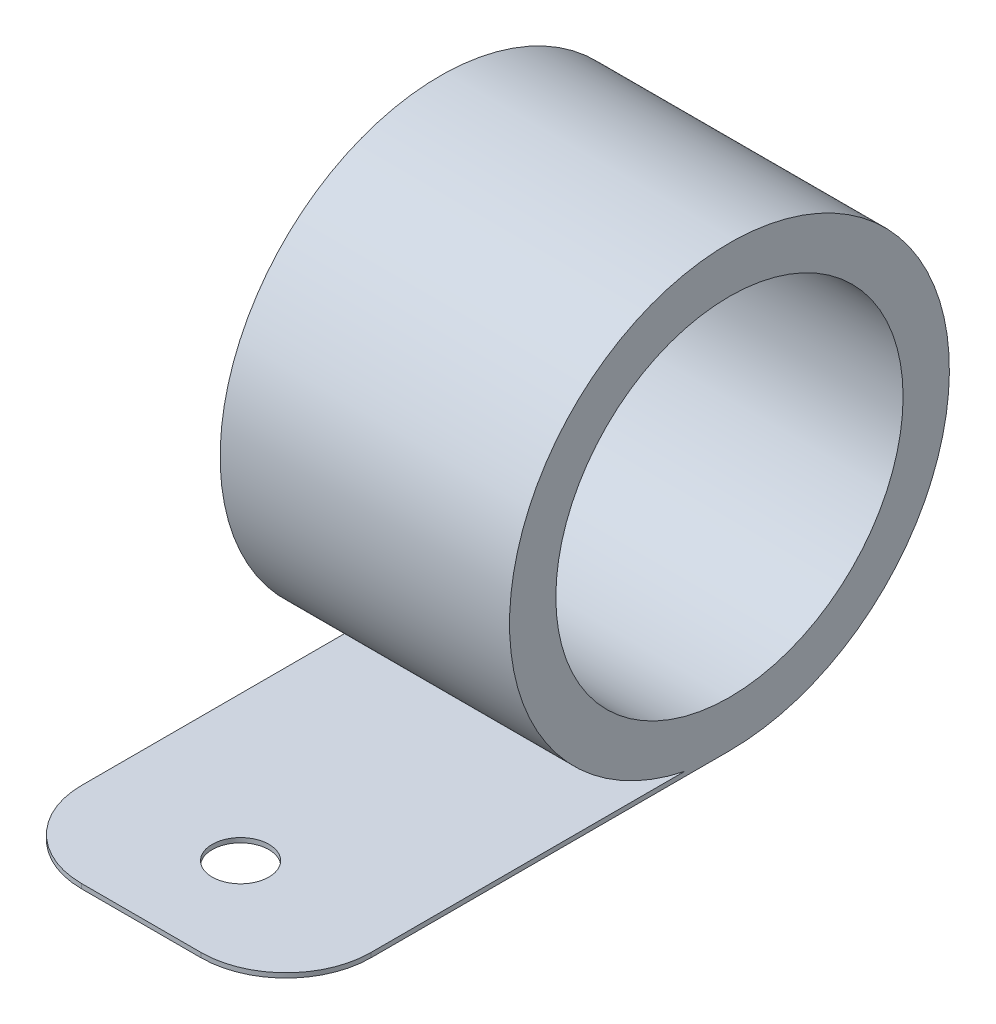
ISO-10303-21;
HEADER;
FILE_DESCRIPTION(('STEP AP214'),'2;1');
FILE_NAME('part.step','',(''),(''),'','','');
FILE_SCHEMA(('AUTOMOTIVE_DESIGN { 1 0 10303 214 1 1 1 1 }'));
ENDSEC;
DATA;
#1=APPLICATION_CONTEXT('core data for automotive mechanical design processes');
#2=APPLICATION_PROTOCOL_DEFINITION('international standard','automotive_design',2000,#1);
#3=PRODUCT_CONTEXT('',#1,'mechanical');
#4=PRODUCT('Part','Part','',(#3));
#5=PRODUCT_RELATED_PRODUCT_CATEGORY('part','',(#4));
#6=PRODUCT_DEFINITION_FORMATION('','',#4);
#7=PRODUCT_DEFINITION_CONTEXT('part definition',#1,'design');
#8=PRODUCT_DEFINITION('design','',#6,#7);
#9=PRODUCT_DEFINITION_SHAPE('','',#8);
#10=(LENGTH_UNIT() NAMED_UNIT(*) SI_UNIT(.MILLI.,.METRE.));
#11=(NAMED_UNIT(*) PLANE_ANGLE_UNIT() SI_UNIT($,.RADIAN.));
#12=(NAMED_UNIT(*) SI_UNIT($,.STERADIAN.) SOLID_ANGLE_UNIT());
#13=UNCERTAINTY_MEASURE_WITH_UNIT(LENGTH_MEASURE(1.E-05),#10,'distance_accuracy_value','');
#14=(GEOMETRIC_REPRESENTATION_CONTEXT(3) GLOBAL_UNCERTAINTY_ASSIGNED_CONTEXT((#13)) GLOBAL_UNIT_ASSIGNED_CONTEXT((#10,
#11,#12)) REPRESENTATION_CONTEXT('',''));
#15=CARTESIAN_POINT('',(0.,0.,0.));
#16=DIRECTION('',(0.,0.,1.));
#17=DIRECTION('',(1.,0.,0.));
#18=AXIS2_PLACEMENT_3D('',#15,#16,#17);
#19=CARTESIAN_POINT('',(12.7,0.,0.));
#20=DIRECTION('',(-1.,0.,0.));
#21=DIRECTION('',(0.,0.,1.));
#22=AXIS2_PLACEMENT_3D('',#19,#20,#21);
#23=CYLINDRICAL_SURFACE('',#22,19.304);
#24=DIRECTION('',(-1.,0.,0.));
#25=VECTOR('',#24,1.);
#26=CARTESIAN_POINT('',(12.7,-18.8976,3.940194188108));
#27=LINE('',#26,#25);
#28=CARTESIAN_POINT('',(12.7,-18.8976,3.940194188108));
#29=VERTEX_POINT('',#28);
#30=CARTESIAN_POINT('',(-12.7,-18.8976,3.940194188108));
#31=VERTEX_POINT('',#30);
#32=EDGE_CURVE('E118',#29,#31,#27,.T.);
#33=ORIENTED_EDGE('',*,*,#32,.F.);
#34=CARTESIAN_POINT('',(12.7,0.,0.));
#35=DIRECTION('',(1.,0.,0.));
#36=DIRECTION('',(0.,0.,-1.));
#37=AXIS2_PLACEMENT_3D('',#34,#35,#36);
#38=CIRCLE('',#37,19.304);
#39=CARTESIAN_POINT('',(12.7,-19.304,0.));
#40=VERTEX_POINT('',#39);
#41=EDGE_CURVE('E101',#40,#29,#38,.T.);
#42=ORIENTED_EDGE('',*,*,#41,.F.);
#43=DIRECTION('',(-1.,0.,0.));
#44=VECTOR('',#43,1.);
#45=CARTESIAN_POINT('',(12.7,-19.304,0.));
#46=LINE('',#45,#44);
#47=CARTESIAN_POINT('',(-12.7,-19.304,0.));
#48=VERTEX_POINT('',#47);
#49=EDGE_CURVE('E105',#40,#48,#46,.T.);
#50=ORIENTED_EDGE('',*,*,#49,.T.);
#51=CARTESIAN_POINT('',(-12.7,0.,0.));
#52=DIRECTION('',(1.,0.,0.));
#53=DIRECTION('',(0.,0.,-1.));
#54=AXIS2_PLACEMENT_3D('',#51,#52,#53);
#55=CIRCLE('',#54,19.304);
#56=EDGE_CURVE('E120',#48,#31,#55,.T.);
#57=ORIENTED_EDGE('',*,*,#56,.T.);
#58=EDGE_LOOP('',(#33,#42,#50,#57));
#59=FACE_BOUND('',#58,.T.);
#60=ADVANCED_FACE('F39',(#59),#23,.T.);
#61=CARTESIAN_POINT('',(12.7,0.,0.));
#62=DIRECTION('',(1.,0.,0.));
#63=DIRECTION('',(0.,0.,-1.));
#64=AXIS2_PLACEMENT_3D('',#61,#62,#63);
#65=PLANE('',#64);
#66=DIRECTION('',(0.,0.,-1.));
#67=VECTOR('',#66,1.);
#68=CARTESIAN_POINT('',(12.7,-18.8976,0.));
#69=LINE('',#68,#67);
#70=CARTESIAN_POINT('',(12.7,-18.8976,31.4635854078537));
#71=VERTEX_POINT('',#70);
#72=EDGE_CURVE('E168',#71,#29,#69,.T.);
#73=ORIENTED_EDGE('',*,*,#72,.F.);
#74=DIRECTION('',(0.,-1.,0.));
#75=VECTOR('',#74,1.);
#76=CARTESIAN_POINT('',(12.7,-19.304,31.4635854078537));
#77=LINE('',#76,#75);
#78=CARTESIAN_POINT('',(12.7,-19.304,31.4635854078537));
#79=VERTEX_POINT('',#78);
#80=EDGE_CURVE('E11',#71,#79,#77,.T.);
#81=ORIENTED_EDGE('',*,*,#80,.T.);
#82=DIRECTION('',(0.,0.,-1.));
#83=VECTOR('',#82,1.);
#84=CARTESIAN_POINT('',(12.7,-19.304,0.));
#85=LINE('',#84,#83);
#86=EDGE_CURVE('E96',#79,#40,#85,.T.);
#87=ORIENTED_EDGE('',*,*,#86,.T.);
#88=ORIENTED_EDGE('',*,*,#41,.T.);
#89=EDGE_LOOP('',(#73,#81,#87,#88));
#90=FACE_BOUND('',#89,.T.);
#91=CARTESIAN_POINT('',(12.7,0.,0.));
#92=DIRECTION('',(1.,0.,0.));
#93=DIRECTION('',(0.,0.,-1.));
#94=AXIS2_PLACEMENT_3D('',#91,#92,#93);
#95=CIRCLE('',#94,15.24);
#96=CARTESIAN_POINT('',(12.7,0.,-15.24));
#97=VERTEX_POINT('',#96);
#98=EDGE_CURVE('E126',#97,#97,#95,.T.);
#99=ORIENTED_EDGE('',*,*,#98,.F.);
#100=EDGE_LOOP('',(#99));
#101=FACE_BOUND('',#100,.T.);
#102=ADVANCED_FACE('F98',(#90,#101),#65,.T.);
#103=CARTESIAN_POINT('',(-12.7,0.,0.));
#104=DIRECTION('',(1.,0.,0.));
#105=DIRECTION('',(0.,0.,-1.));
#106=AXIS2_PLACEMENT_3D('',#103,#104,#105);
#107=PLANE('',#106);
#108=DIRECTION('',(0.,0.,1.));
#109=VECTOR('',#108,1.);
#110=CARTESIAN_POINT('',(-12.7,-19.304,0.));
#111=LINE('',#110,#109);
#112=CARTESIAN_POINT('',(-12.7,-19.304,31.4635854078537));
#113=VERTEX_POINT('',#112);
#114=EDGE_CURVE('E111',#48,#113,#111,.T.);
#115=ORIENTED_EDGE('',*,*,#114,.T.);
#116=DIRECTION('',(0.,-1.,0.));
#117=VECTOR('',#116,1.);
#118=CARTESIAN_POINT('',(-12.7,0.,31.4635854078537));
#119=LINE('',#118,#117);
#120=CARTESIAN_POINT('',(-12.7,-18.8976,31.4635854078537));
#121=VERTEX_POINT('',#120);
#122=EDGE_CURVE('E63',#113,#121,#119,.F.);
#123=ORIENTED_EDGE('',*,*,#122,.T.);
#124=DIRECTION('',(0.,0.,1.));
#125=VECTOR('',#124,1.);
#126=CARTESIAN_POINT('',(-12.7,-18.8976,0.));
#127=LINE('',#126,#125);
#128=EDGE_CURVE('E152',#31,#121,#127,.T.);
#129=ORIENTED_EDGE('',*,*,#128,.F.);
#130=ORIENTED_EDGE('',*,*,#56,.F.);
#131=EDGE_LOOP('',(#115,#123,#129,#130));
#132=FACE_BOUND('',#131,.T.);
#133=CARTESIAN_POINT('',(-12.7,0.,0.));
#134=DIRECTION('',(1.,0.,0.));
#135=DIRECTION('',(0.,0.,-1.));
#136=AXIS2_PLACEMENT_3D('',#133,#134,#135);
#137=CIRCLE('',#136,15.24);
#138=CARTESIAN_POINT('',(-12.7,0.,-15.24));
#139=VERTEX_POINT('',#138);
#140=EDGE_CURVE('E129',#139,#139,#137,.T.);
#141=ORIENTED_EDGE('',*,*,#140,.T.);
#142=EDGE_LOOP('',(#141));
#143=FACE_BOUND('',#142,.T.);
#144=ADVANCED_FACE('F163',(#132,#143),#107,.F.);
#145=CARTESIAN_POINT('',(12.7,0.,0.));
#146=DIRECTION('',(-1.,0.,0.));
#147=DIRECTION('',(0.,0.,1.));
#148=AXIS2_PLACEMENT_3D('',#145,#146,#147);
#149=CYLINDRICAL_SURFACE('',#148,15.24);
#150=ORIENTED_EDGE('',*,*,#98,.T.);
#151=EDGE_LOOP('',(#150));
#152=FACE_BOUND('',#151,.T.);
#153=ORIENTED_EDGE('',*,*,#140,.F.);
#154=EDGE_LOOP('',(#153));
#155=FACE_BOUND('',#154,.T.);
#156=ADVANCED_FACE('F178',(#152,#155),#149,.F.);
#157=CARTESIAN_POINT('',(0.,-18.8976,0.));
#158=DIRECTION('',(0.,-1.,0.));
#159=DIRECTION('',(0.,0.,-1.));
#160=AXIS2_PLACEMENT_3D('',#157,#158,#159);
#161=PLANE('',#160);
#162=CARTESIAN_POINT('',(0.,-18.8976,30.2113854078537));
#163=DIRECTION('',(0.,-1.,0.));
#164=DIRECTION('',(0.,0.,-1.));
#165=AXIS2_PLACEMENT_3D('',#162,#163,#164);
#166=CIRCLE('',#165,2.4892);
#167=CARTESIAN_POINT('',(0.,-18.8976,27.7221854078537));
#168=VERTEX_POINT('',#167);
#169=EDGE_CURVE('E106',#168,#168,#166,.T.);
#170=ORIENTED_EDGE('',*,*,#169,.T.);
#171=EDGE_LOOP('',(#170));
#172=FACE_BOUND('',#171,.T.);
#173=ORIENTED_EDGE('',*,*,#128,.T.);
#174=CARTESIAN_POINT('',(-5.24,-18.8976,31.4635854078537));
#175=DIRECTION('',(0.,-1.,0.));
#176=DIRECTION('',(0.,0.,-1.));
#177=AXIS2_PLACEMENT_3D('',#174,#175,#176);
#178=CIRCLE('',#177,7.46);
#179=CARTESIAN_POINT('',(-5.24,-18.8976,38.9235854078537));
#180=VERTEX_POINT('',#179);
#181=EDGE_CURVE('E48',#121,#180,#178,.F.);
#182=ORIENTED_EDGE('',*,*,#181,.T.);
#183=DIRECTION('',(1.,0.,0.));
#184=VECTOR('',#183,1.);
#185=CARTESIAN_POINT('',(12.7,-18.8976,38.9235854078537));
#186=LINE('',#185,#184);
#187=CARTESIAN_POINT('',(5.24,-18.8976,38.9235854078537));
#188=VERTEX_POINT('',#187);
#189=EDGE_CURVE('E151',#180,#188,#186,.T.);
#190=ORIENTED_EDGE('',*,*,#189,.T.);
#191=CARTESIAN_POINT('',(5.24,-18.8976,31.4635854078537));
#192=DIRECTION('',(0.,-1.,0.));
#193=DIRECTION('',(0.,0.,-1.));
#194=AXIS2_PLACEMENT_3D('',#191,#192,#193);
#195=CIRCLE('',#194,7.46);
#196=EDGE_CURVE('E55',#188,#71,#195,.F.);
#197=ORIENTED_EDGE('',*,*,#196,.T.);
#198=ORIENTED_EDGE('',*,*,#72,.T.);
#199=ORIENTED_EDGE('',*,*,#32,.T.);
#200=EDGE_LOOP('',(#173,#182,#190,#197,#198,#199));
#201=FACE_BOUND('',#200,.T.);
#202=ADVANCED_FACE('F150',(#172,#201),#161,.F.);
#203=CARTESIAN_POINT('',(12.7,-18.8976,38.9235854078537));
#204=DIRECTION('',(0.,0.,-1.));
#205=DIRECTION('',(-1.,0.,0.));
#206=AXIS2_PLACEMENT_3D('',#203,#204,#205);
#207=PLANE('',#206);
#208=ORIENTED_EDGE('',*,*,#189,.F.);
#209=DIRECTION('',(0.,-1.,0.));
#210=VECTOR('',#209,1.);
#211=CARTESIAN_POINT('',(-5.24,-18.8976,38.9235854078537));
#212=LINE('',#211,#210);
#213=CARTESIAN_POINT('',(-5.24,-19.304,38.9235854078537));
#214=VERTEX_POINT('',#213);
#215=EDGE_CURVE('E134',#180,#214,#212,.T.);
#216=ORIENTED_EDGE('',*,*,#215,.T.);
#217=DIRECTION('',(1.,0.,0.));
#218=VECTOR('',#217,1.);
#219=CARTESIAN_POINT('',(12.7,-19.304,38.9235854078537));
#220=LINE('',#219,#218);
#221=CARTESIAN_POINT('',(5.24,-19.304,38.9235854078537));
#222=VERTEX_POINT('',#221);
#223=EDGE_CURVE('E162',#214,#222,#220,.T.);
#224=ORIENTED_EDGE('',*,*,#223,.T.);
#225=DIRECTION('',(0.,-1.,0.));
#226=VECTOR('',#225,1.);
#227=CARTESIAN_POINT('',(5.24,-18.8976,38.9235854078537));
#228=LINE('',#227,#226);
#229=EDGE_CURVE('E124',#222,#188,#228,.F.);
#230=ORIENTED_EDGE('',*,*,#229,.T.);
#231=EDGE_LOOP('',(#208,#216,#224,#230));
#232=FACE_BOUND('',#231,.T.);
#233=ADVANCED_FACE('F156',(#232),#207,.F.);
#234=CARTESIAN_POINT('',(0.,-19.304,0.));
#235=DIRECTION('',(0.,-1.,0.));
#236=DIRECTION('',(0.,0.,-1.));
#237=AXIS2_PLACEMENT_3D('',#234,#235,#236);
#238=PLANE('',#237);
#239=CARTESIAN_POINT('',(0.,-19.304,30.2113854078537));
#240=DIRECTION('',(0.,1.,0.));
#241=DIRECTION('',(0.,0.,1.));
#242=AXIS2_PLACEMENT_3D('',#239,#240,#241);
#243=CIRCLE('',#242,2.4892);
#244=CARTESIAN_POINT('',(0.,-19.304,32.7005854078537));
#245=VERTEX_POINT('',#244);
#246=EDGE_CURVE('E271',#245,#245,#243,.T.);
#247=ORIENTED_EDGE('',*,*,#246,.T.);
#248=EDGE_LOOP('',(#247));
#249=FACE_BOUND('',#248,.T.);
#250=ORIENTED_EDGE('',*,*,#223,.F.);
#251=CARTESIAN_POINT('',(-5.24,-19.304,31.4635854078537));
#252=DIRECTION('',(0.,-1.,0.));
#253=DIRECTION('',(0.,0.,-1.));
#254=AXIS2_PLACEMENT_3D('',#251,#252,#253);
#255=CIRCLE('',#254,7.46);
#256=EDGE_CURVE('E141',#214,#113,#255,.T.);
#257=ORIENTED_EDGE('',*,*,#256,.T.);
#258=ORIENTED_EDGE('',*,*,#114,.F.);
#259=ORIENTED_EDGE('',*,*,#49,.F.);
#260=ORIENTED_EDGE('',*,*,#86,.F.);
#261=CARTESIAN_POINT('',(5.24,-19.304,31.4635854078537));
#262=DIRECTION('',(0.,-1.,0.));
#263=DIRECTION('',(0.,0.,-1.));
#264=AXIS2_PLACEMENT_3D('',#261,#262,#263);
#265=CIRCLE('',#264,7.46);
#266=EDGE_CURVE('E138',#79,#222,#265,.T.);
#267=ORIENTED_EDGE('',*,*,#266,.T.);
#268=EDGE_LOOP('',(#250,#257,#258,#259,#260,#267));
#269=FACE_BOUND('',#268,.T.);
#270=ADVANCED_FACE('F110',(#249,#269),#238,.T.);
#271=CARTESIAN_POINT('',(0.,-19.304,30.2113854078537));
#272=DIRECTION('',(0.,1.,0.));
#273=DIRECTION('',(0.,0.,1.));
#274=AXIS2_PLACEMENT_3D('',#271,#272,#273);
#275=CYLINDRICAL_SURFACE('',#274,2.4892);
#276=ORIENTED_EDGE('',*,*,#246,.F.);
#277=EDGE_LOOP('',(#276));
#278=FACE_BOUND('',#277,.T.);
#279=ORIENTED_EDGE('',*,*,#169,.F.);
#280=EDGE_LOOP('',(#279));
#281=FACE_BOUND('',#280,.T.);
#282=ADVANCED_FACE('F196',(#278,#281),#275,.F.);
#283=CARTESIAN_POINT('',(-5.24,-18.8976,31.4635854078537));
#284=DIRECTION('',(0.,-1.,0.));
#285=DIRECTION('',(0.,0.,-1.));
#286=AXIS2_PLACEMENT_3D('',#283,#284,#285);
#287=CYLINDRICAL_SURFACE('',#286,7.46);
#288=ORIENTED_EDGE('',*,*,#181,.F.);
#289=ORIENTED_EDGE('',*,*,#122,.F.);
#290=ORIENTED_EDGE('',*,*,#256,.F.);
#291=ORIENTED_EDGE('',*,*,#215,.F.);
#292=EDGE_LOOP('',(#288,#289,#290,#291));
#293=FACE_BOUND('',#292,.T.);
#294=ADVANCED_FACE('F161',(#293),#287,.T.);
#295=CARTESIAN_POINT('',(5.24,0.,31.4635854078537));
#296=DIRECTION('',(0.,1.,0.));
#297=DIRECTION('',(0.,0.,1.));
#298=AXIS2_PLACEMENT_3D('',#295,#296,#297);
#299=CYLINDRICAL_SURFACE('',#298,7.46);
#300=ORIENTED_EDGE('',*,*,#196,.F.);
#301=ORIENTED_EDGE('',*,*,#229,.F.);
#302=ORIENTED_EDGE('',*,*,#266,.F.);
#303=ORIENTED_EDGE('',*,*,#80,.F.);
#304=EDGE_LOOP('',(#300,#301,#302,#303));
#305=FACE_BOUND('',#304,.T.);
#306=ADVANCED_FACE('F41',(#305),#299,.T.);
#307=CLOSED_SHELL('',(#60,#102,#144,#156,#202,#233,#270,#282,#294,#306));
#308=MANIFOLD_SOLID_BREP('B2',#307);
#309=ADVANCED_BREP_SHAPE_REPRESENTATION('',(#18,#308),#14);
#310=SHAPE_DEFINITION_REPRESENTATION(#9,#309);
ENDSEC;
END-ISO-10303-21;
